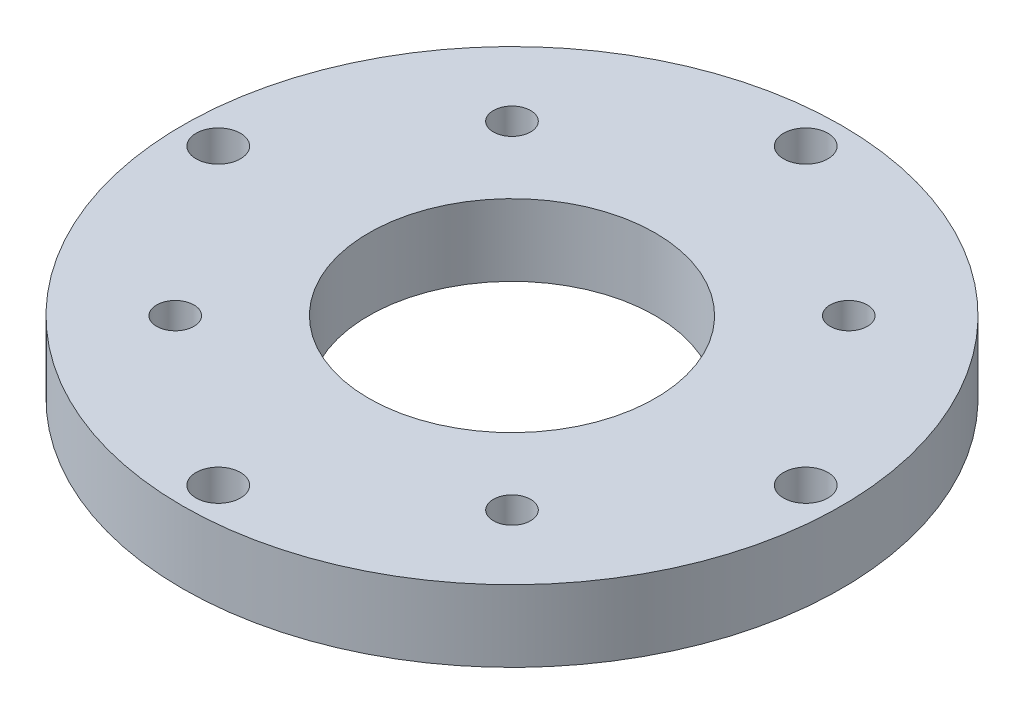
ISO-10303-21;
HEADER;
FILE_DESCRIPTION(('STEP AP214'),'2;1');
FILE_NAME('part.step','',(''),(''),'','','');
FILE_SCHEMA(('AUTOMOTIVE_DESIGN { 1 0 10303 214 1 1 1 1 }'));
ENDSEC;
DATA;
#1=APPLICATION_CONTEXT('core data for automotive mechanical design processes');
#2=APPLICATION_PROTOCOL_DEFINITION('international standard','automotive_design',2000,#1);
#3=PRODUCT_CONTEXT('',#1,'mechanical');
#4=PRODUCT('Part','Part','',(#3));
#5=PRODUCT_RELATED_PRODUCT_CATEGORY('part','',(#4));
#6=PRODUCT_DEFINITION_FORMATION('','',#4);
#7=PRODUCT_DEFINITION_CONTEXT('part definition',#1,'design');
#8=PRODUCT_DEFINITION('design','',#6,#7);
#9=PRODUCT_DEFINITION_SHAPE('','',#8);
#10=(LENGTH_UNIT() NAMED_UNIT(*) SI_UNIT(.MILLI.,.METRE.));
#11=(NAMED_UNIT(*) PLANE_ANGLE_UNIT() SI_UNIT($,.RADIAN.));
#12=(NAMED_UNIT(*) SI_UNIT($,.STERADIAN.) SOLID_ANGLE_UNIT());
#13=UNCERTAINTY_MEASURE_WITH_UNIT(LENGTH_MEASURE(1.E-05),#10,'distance_accuracy_value','');
#14=(GEOMETRIC_REPRESENTATION_CONTEXT(3) GLOBAL_UNCERTAINTY_ASSIGNED_CONTEXT((#13)) GLOBAL_UNIT_ASSIGNED_CONTEXT((#10,
#11,#12)) REPRESENTATION_CONTEXT('',''));
#15=CARTESIAN_POINT('',(0.,0.,0.));
#16=DIRECTION('',(0.,0.,1.));
#17=DIRECTION('',(1.,0.,0.));
#18=AXIS2_PLACEMENT_3D('',#15,#16,#17);
#19=CARTESIAN_POINT('',(-24.2933956091395,4.,14.0257984944668));
#20=DIRECTION('',(-0.866025403784439,0.,0.5));
#21=DIRECTION('',(0.5,0.,0.866025403784439));
#22=AXIS2_PLACEMENT_3D('',#19,#20,#21);
#23=PLANE('',#22);
#24=DIRECTION('',(-0.5,0.,-0.866025403784439));
#25=VECTOR('',#24,1.);
#26=CARTESIAN_POINT('',(-24.2933956091395,0.,14.0257984944668));
#27=LINE('',#26,#25);
#28=CARTESIAN_POINT('',(-18.8234628195631,0.,23.5));
#29=VERTEX_POINT('',#28);
#30=CARTESIAN_POINT('',(-21.1617314097811,0.,19.45));
#31=VERTEX_POINT('',#30);
#32=EDGE_CURVE('E362',#29,#31,#27,.T.);
#33=ORIENTED_EDGE('',*,*,#32,.F.);
#34=DIRECTION('',(0.,-1.,0.));
#35=VECTOR('',#34,1.);
#36=CARTESIAN_POINT('',(-18.8234628195631,4.,23.5));
#37=LINE('',#36,#35);
#38=CARTESIAN_POINT('',(-18.8234628195631,4.,23.5));
#39=VERTEX_POINT('',#38);
#40=EDGE_CURVE('E12',#39,#29,#37,.T.);
#41=ORIENTED_EDGE('',*,*,#40,.F.);
#42=DIRECTION('',(-0.5,0.,-0.866025403784439));
#43=VECTOR('',#42,1.);
#44=CARTESIAN_POINT('',(-24.2933956091395,4.,14.0257984944668));
#45=LINE('',#44,#43);
#46=CARTESIAN_POINT('',(-21.1617314097811,4.,19.45));
#47=VERTEX_POINT('',#46);
#48=EDGE_CURVE('E266',#39,#47,#45,.T.);
#49=ORIENTED_EDGE('',*,*,#48,.T.);
#50=DIRECTION('',(0.,-1.,0.));
#51=VECTOR('',#50,1.);
#52=CARTESIAN_POINT('',(-21.1617314097811,4.,19.45));
#53=LINE('',#52,#51);
#54=EDGE_CURVE('E197',#47,#31,#53,.T.);
#55=ORIENTED_EDGE('',*,*,#54,.T.);
#56=EDGE_LOOP('',(#33,#41,#49,#55));
#57=FACE_BOUND('',#56,.T.);
#58=ADVANCED_FACE('F93',(#57),#23,.T.);
#59=CARTESIAN_POINT('',(-3.94179862020517,4.,-2.27579849446675));
#60=DIRECTION('',(-0.866025403784439,0.,-0.5));
#61=DIRECTION('',(-0.5,0.,0.866025403784439));
#62=AXIS2_PLACEMENT_3D('',#59,#60,#61);
#63=PLANE('',#62);
#64=DIRECTION('',(0.5,0.,-0.866025403784439));
#65=VECTOR('',#64,1.);
#66=CARTESIAN_POINT('',(-3.94179862020517,0.,-2.27579849446675));
#67=LINE('',#66,#65);
#68=CARTESIAN_POINT('',(-21.1617314097811,0.,27.55));
#69=VERTEX_POINT('',#68);
#70=EDGE_CURVE('E364',#69,#29,#67,.T.);
#71=ORIENTED_EDGE('',*,*,#70,.F.);
#72=DIRECTION('',(0.,-1.,0.));
#73=VECTOR('',#72,1.);
#74=CARTESIAN_POINT('',(-21.1617314097811,4.,27.55));
#75=LINE('',#74,#73);
#76=CARTESIAN_POINT('',(-21.1617314097811,4.,27.55));
#77=VERTEX_POINT('',#76);
#78=EDGE_CURVE('E103',#77,#69,#75,.T.);
#79=ORIENTED_EDGE('',*,*,#78,.F.);
#80=DIRECTION('',(0.5,0.,-0.866025403784439));
#81=VECTOR('',#80,1.);
#82=CARTESIAN_POINT('',(-3.94179862020517,4.,-2.27579849446675));
#83=LINE('',#82,#81);
#84=EDGE_CURVE('E276',#77,#39,#83,.T.);
#85=ORIENTED_EDGE('',*,*,#84,.T.);
#86=ORIENTED_EDGE('',*,*,#40,.T.);
#87=EDGE_LOOP('',(#71,#79,#85,#86));
#88=FACE_BOUND('',#87,.T.);
#89=ADVANCED_FACE('F521',(#88),#63,.T.);
#90=CARTESIAN_POINT('',(0.,4.,27.55));
#91=DIRECTION('',(0.,0.,-1.));
#92=DIRECTION('',(-1.,0.,0.));
#93=AXIS2_PLACEMENT_3D('',#90,#91,#92);
#94=PLANE('',#93);
#95=DIRECTION('',(1.,0.,0.));
#96=VECTOR('',#95,1.);
#97=CARTESIAN_POINT('',(0.,0.,27.55));
#98=LINE('',#97,#96);
#99=CARTESIAN_POINT('',(-25.8382685902171,0.,27.55));
#100=VERTEX_POINT('',#99);
#101=EDGE_CURVE('E367',#100,#69,#98,.T.);
#102=ORIENTED_EDGE('',*,*,#101,.F.);
#103=DIRECTION('',(0.,-1.,0.));
#104=VECTOR('',#103,1.);
#105=CARTESIAN_POINT('',(-25.8382685902171,4.,27.55));
#106=LINE('',#105,#104);
#107=CARTESIAN_POINT('',(-25.8382685902171,4.,27.55));
#108=VERTEX_POINT('',#107);
#109=EDGE_CURVE('E384',#108,#100,#106,.T.);
#110=ORIENTED_EDGE('',*,*,#109,.F.);
#111=DIRECTION('',(1.,0.,0.));
#112=VECTOR('',#111,1.);
#113=CARTESIAN_POINT('',(0.,4.,27.55));
#114=LINE('',#113,#112);
#115=EDGE_CURVE('E279',#108,#77,#114,.T.);
#116=ORIENTED_EDGE('',*,*,#115,.T.);
#117=ORIENTED_EDGE('',*,*,#78,.T.);
#118=EDGE_LOOP('',(#102,#110,#116,#117));
#119=FACE_BOUND('',#118,.T.);
#120=ADVANCED_FACE('F526',(#119),#94,.T.);
#121=CARTESIAN_POINT('',(-31.3082013797935,4.,18.0757984944668));
#122=DIRECTION('',(0.866025403784439,0.,-0.5));
#123=DIRECTION('',(-0.5,0.,-0.866025403784439));
#124=AXIS2_PLACEMENT_3D('',#121,#122,#123);
#125=PLANE('',#124);
#126=DIRECTION('',(0.5,0.,0.866025403784439));
#127=VECTOR('',#126,1.);
#128=CARTESIAN_POINT('',(-31.3082013797935,0.,18.0757984944668));
#129=LINE('',#128,#127);
#130=CARTESIAN_POINT('',(-28.1765371804351,0.,23.5));
#131=VERTEX_POINT('',#130);
#132=EDGE_CURVE('E370',#131,#100,#129,.T.);
#133=ORIENTED_EDGE('',*,*,#132,.F.);
#134=DIRECTION('',(0.,-1.,0.));
#135=VECTOR('',#134,1.);
#136=CARTESIAN_POINT('',(-28.1765371804351,4.,23.5));
#137=LINE('',#136,#135);
#138=CARTESIAN_POINT('',(-28.1765371804351,4.,23.5));
#139=VERTEX_POINT('',#138);
#140=EDGE_CURVE('E382',#139,#131,#137,.T.);
#141=ORIENTED_EDGE('',*,*,#140,.F.);
#142=DIRECTION('',(0.5,0.,0.866025403784439));
#143=VECTOR('',#142,1.);
#144=CARTESIAN_POINT('',(-31.3082013797935,4.,18.0757984944668));
#145=LINE('',#144,#143);
#146=EDGE_CURVE('E288',#139,#108,#145,.T.);
#147=ORIENTED_EDGE('',*,*,#146,.T.);
#148=ORIENTED_EDGE('',*,*,#109,.T.);
#149=EDGE_LOOP('',(#133,#141,#147,#148));
#150=FACE_BOUND('',#149,.T.);
#151=ADVANCED_FACE('F671',(#150),#125,.T.);
#152=CARTESIAN_POINT('',(-10.9566043908591,4.,-6.32579849446675));
#153=DIRECTION('',(0.866025403784439,0.,0.5));
#154=DIRECTION('',(0.5,0.,-0.866025403784439));
#155=AXIS2_PLACEMENT_3D('',#152,#153,#154);
#156=PLANE('',#155);
#157=DIRECTION('',(-0.5,0.,0.866025403784439));
#158=VECTOR('',#157,1.);
#159=CARTESIAN_POINT('',(-10.9566043908591,0.,-6.32579849446675));
#160=LINE('',#159,#158);
#161=CARTESIAN_POINT('',(-25.8382685902171,0.,19.45));
#162=VERTEX_POINT('',#161);
#163=EDGE_CURVE('E373',#162,#131,#160,.T.);
#164=ORIENTED_EDGE('',*,*,#163,.F.);
#165=DIRECTION('',(0.,-1.,0.));
#166=VECTOR('',#165,1.);
#167=CARTESIAN_POINT('',(-25.8382685902171,4.,19.45));
#168=LINE('',#167,#166);
#169=CARTESIAN_POINT('',(-25.8382685902171,4.,19.45));
#170=VERTEX_POINT('',#169);
#171=EDGE_CURVE('E189',#170,#162,#168,.T.);
#172=ORIENTED_EDGE('',*,*,#171,.F.);
#173=DIRECTION('',(-0.5,0.,0.866025403784439));
#174=VECTOR('',#173,1.);
#175=CARTESIAN_POINT('',(-10.9566043908591,4.,-6.32579849446675));
#176=LINE('',#175,#174);
#177=EDGE_CURVE('E112',#170,#139,#176,.T.);
#178=ORIENTED_EDGE('',*,*,#177,.T.);
#179=ORIENTED_EDGE('',*,*,#140,.T.);
#180=EDGE_LOOP('',(#164,#172,#178,#179));
#181=FACE_BOUND('',#180,.T.);
#182=ADVANCED_FACE('F668',(#181),#156,.T.);
#183=CARTESIAN_POINT('',(14.0257984944671,4.,24.29339560914));
#184=DIRECTION('',(0.5,0.,0.866025403784439));
#185=DIRECTION('',(0.866025403784439,0.,-0.5));
#186=AXIS2_PLACEMENT_3D('',#183,#184,#185);
#187=PLANE('',#186);
#188=DIRECTION('',(-0.866025403784439,0.,0.5));
#189=VECTOR('',#188,1.);
#190=CARTESIAN_POINT('',(14.0257984944671,0.,24.29339560914));
#191=LINE('',#190,#189);
#192=CARTESIAN_POINT('',(23.5000000000012,0.,18.8234628195632));
#193=VERTEX_POINT('',#192);
#194=CARTESIAN_POINT('',(19.4500000000012,0.,21.1617314097811));
#195=VERTEX_POINT('',#194);
#196=EDGE_CURVE('E344',#193,#195,#191,.T.);
#197=ORIENTED_EDGE('',*,*,#196,.F.);
#198=DIRECTION('',(0.,-1.,0.));
#199=VECTOR('',#198,1.);
#200=CARTESIAN_POINT('',(23.5000000000012,4.,18.8234628195632));
#201=LINE('',#200,#199);
#202=CARTESIAN_POINT('',(23.5000000000012,4.,18.8234628195632));
#203=VERTEX_POINT('',#202);
#204=EDGE_CURVE('E273',#203,#193,#201,.T.);
#205=ORIENTED_EDGE('',*,*,#204,.F.);
#206=DIRECTION('',(-0.866025403784439,0.,0.5));
#207=VECTOR('',#206,1.);
#208=CARTESIAN_POINT('',(14.0257984944671,4.,24.29339560914));
#209=LINE('',#208,#207);
#210=CARTESIAN_POINT('',(19.4500000000012,4.,21.1617314097811));
#211=VERTEX_POINT('',#210);
#212=EDGE_CURVE('E471',#203,#211,#209,.T.);
#213=ORIENTED_EDGE('',*,*,#212,.T.);
#214=DIRECTION('',(0.,-1.,0.));
#215=VECTOR('',#214,1.);
#216=CARTESIAN_POINT('',(19.4500000000012,4.,21.1617314097811));
#217=LINE('',#216,#215);
#218=EDGE_CURVE('E387',#211,#195,#217,.T.);
#219=ORIENTED_EDGE('',*,*,#218,.T.);
#220=EDGE_LOOP('',(#197,#205,#213,#219));
#221=FACE_BOUND('',#220,.T.);
#222=ADVANCED_FACE('F505',(#221),#187,.T.);
#223=CARTESIAN_POINT('',(-2.27579849446648,4.,3.9417986202047));
#224=DIRECTION('',(-0.5,0.,0.866025403784439));
#225=DIRECTION('',(0.866025403784439,0.,0.5));
#226=AXIS2_PLACEMENT_3D('',#223,#224,#225);
#227=PLANE('',#226);
#228=DIRECTION('',(-0.866025403784439,0.,-0.5));
#229=VECTOR('',#228,1.);
#230=CARTESIAN_POINT('',(-2.27579849446648,0.,3.9417986202047));
#231=LINE('',#230,#229);
#232=CARTESIAN_POINT('',(27.5500000000012,0.,21.1617314097811));
#233=VERTEX_POINT('',#232);
#234=EDGE_CURVE('E347',#233,#193,#231,.T.);
#235=ORIENTED_EDGE('',*,*,#234,.F.);
#236=DIRECTION('',(0.,-1.,0.));
#237=VECTOR('',#236,1.);
#238=CARTESIAN_POINT('',(27.5500000000012,4.,21.1617314097811));
#239=LINE('',#238,#237);
#240=CARTESIAN_POINT('',(27.5500000000012,4.,21.1617314097811));
#241=VERTEX_POINT('',#240);
#242=EDGE_CURVE('E396',#241,#233,#239,.T.);
#243=ORIENTED_EDGE('',*,*,#242,.F.);
#244=DIRECTION('',(-0.866025403784439,0.,-0.5));
#245=VECTOR('',#244,1.);
#246=CARTESIAN_POINT('',(-2.27579849446648,4.,3.9417986202047));
#247=LINE('',#246,#245);
#248=EDGE_CURVE('E474',#241,#203,#247,.T.);
#249=ORIENTED_EDGE('',*,*,#248,.T.);
#250=ORIENTED_EDGE('',*,*,#204,.T.);
#251=EDGE_LOOP('',(#235,#243,#249,#250));
#252=FACE_BOUND('',#251,.T.);
#253=ADVANCED_FACE('F509',(#252),#227,.T.);
#254=CARTESIAN_POINT('',(27.5500000000012,4.,0.));
#255=DIRECTION('',(-1.,0.,0.));
#256=DIRECTION('',(0.,0.,1.));
#257=AXIS2_PLACEMENT_3D('',#254,#255,#256);
#258=PLANE('',#257);
#259=DIRECTION('',(0.,0.,-1.));
#260=VECTOR('',#259,1.);
#261=CARTESIAN_POINT('',(27.5500000000012,0.,0.));
#262=LINE('',#261,#260);
#263=CARTESIAN_POINT('',(27.5500000000012,0.,25.8382685902171));
#264=VERTEX_POINT('',#263);
#265=EDGE_CURVE('E350',#264,#233,#262,.T.);
#266=ORIENTED_EDGE('',*,*,#265,.F.);
#267=DIRECTION('',(0.,-1.,0.));
#268=VECTOR('',#267,1.);
#269=CARTESIAN_POINT('',(27.5500000000012,4.,25.8382685902171));
#270=LINE('',#269,#268);
#271=CARTESIAN_POINT('',(27.5500000000012,4.,25.8382685902171));
#272=VERTEX_POINT('',#271);
#273=EDGE_CURVE('E394',#272,#264,#270,.T.);
#274=ORIENTED_EDGE('',*,*,#273,.F.);
#275=DIRECTION('',(0.,0.,-1.));
#276=VECTOR('',#275,1.);
#277=CARTESIAN_POINT('',(27.5500000000012,4.,0.));
#278=LINE('',#277,#276);
#279=EDGE_CURVE('E477',#272,#241,#278,.T.);
#280=ORIENTED_EDGE('',*,*,#279,.T.);
#281=ORIENTED_EDGE('',*,*,#242,.T.);
#282=EDGE_LOOP('',(#266,#274,#280,#281));
#283=FACE_BOUND('',#282,.T.);
#284=ADVANCED_FACE('F511',(#283),#258,.T.);
#285=CARTESIAN_POINT('',(18.0757984944671,4.,31.308201379794));
#286=DIRECTION('',(-0.5,0.,-0.866025403784439));
#287=DIRECTION('',(-0.866025403784439,0.,0.5));
#288=AXIS2_PLACEMENT_3D('',#285,#286,#287);
#289=PLANE('',#288);
#290=DIRECTION('',(0.866025403784439,0.,-0.5));
#291=VECTOR('',#290,1.);
#292=CARTESIAN_POINT('',(18.0757984944671,0.,31.308201379794));
#293=LINE('',#292,#291);
#294=CARTESIAN_POINT('',(23.5000000000012,0.,28.1765371804351));
#295=VERTEX_POINT('',#294);
#296=EDGE_CURVE('E353',#295,#264,#293,.T.);
#297=ORIENTED_EDGE('',*,*,#296,.F.);
#298=DIRECTION('',(0.,-1.,0.));
#299=VECTOR('',#298,1.);
#300=CARTESIAN_POINT('',(23.5000000000012,4.,28.1765371804351));
#301=LINE('',#300,#299);
#302=CARTESIAN_POINT('',(23.5000000000012,4.,28.1765371804351));
#303=VERTEX_POINT('',#302);
#304=EDGE_CURVE('E392',#303,#295,#301,.T.);
#305=ORIENTED_EDGE('',*,*,#304,.F.);
#306=DIRECTION('',(0.866025403784439,0.,-0.5));
#307=VECTOR('',#306,1.);
#308=CARTESIAN_POINT('',(18.0757984944671,4.,31.308201379794));
#309=LINE('',#308,#307);
#310=EDGE_CURVE('E480',#303,#272,#309,.T.);
#311=ORIENTED_EDGE('',*,*,#310,.T.);
#312=ORIENTED_EDGE('',*,*,#273,.T.);
#313=EDGE_LOOP('',(#297,#305,#311,#312));
#314=FACE_BOUND('',#313,.T.);
#315=ADVANCED_FACE('F495',(#314),#289,.T.);
#316=CARTESIAN_POINT('',(-6.32579849446648,4.,10.9566043908587));
#317=DIRECTION('',(0.5,0.,-0.866025403784439));
#318=DIRECTION('',(-0.866025403784439,0.,-0.5));
#319=AXIS2_PLACEMENT_3D('',#316,#317,#318);
#320=PLANE('',#319);
#321=DIRECTION('',(0.866025403784439,0.,0.5));
#322=VECTOR('',#321,1.);
#323=CARTESIAN_POINT('',(-6.32579849446648,0.,10.9566043908587));
#324=LINE('',#323,#322);
#325=CARTESIAN_POINT('',(19.4500000000012,0.,25.8382685902171));
#326=VERTEX_POINT('',#325);
#327=EDGE_CURVE('E356',#326,#295,#324,.T.);
#328=ORIENTED_EDGE('',*,*,#327,.F.);
#329=DIRECTION('',(0.,-1.,0.));
#330=VECTOR('',#329,1.);
#331=CARTESIAN_POINT('',(19.4500000000012,4.,25.8382685902171));
#332=LINE('',#331,#330);
#333=CARTESIAN_POINT('',(19.4500000000012,4.,25.8382685902171));
#334=VERTEX_POINT('',#333);
#335=EDGE_CURVE('E389',#334,#326,#332,.T.);
#336=ORIENTED_EDGE('',*,*,#335,.F.);
#337=DIRECTION('',(0.866025403784439,0.,0.5));
#338=VECTOR('',#337,1.);
#339=CARTESIAN_POINT('',(-6.32579849446648,4.,10.9566043908587));
#340=LINE('',#339,#338);
#341=EDGE_CURVE('E282',#334,#303,#340,.T.);
#342=ORIENTED_EDGE('',*,*,#341,.T.);
#343=ORIENTED_EDGE('',*,*,#304,.T.);
#344=EDGE_LOOP('',(#328,#336,#342,#343));
#345=FACE_BOUND('',#344,.T.);
#346=ADVANCED_FACE('F486',(#345),#320,.T.);
#347=CARTESIAN_POINT('',(24.2933956091409,4.,-14.0257984944676));
#348=DIRECTION('',(0.866025403784439,0.,-0.5));
#349=DIRECTION('',(-0.5,0.,-0.866025403784439));
#350=AXIS2_PLACEMENT_3D('',#347,#348,#349);
#351=PLANE('',#350);
#352=DIRECTION('',(0.5,0.,0.866025403784439));
#353=VECTOR('',#352,1.);
#354=CARTESIAN_POINT('',(24.2933956091409,0.,-14.0257984944676));
#355=LINE('',#354,#353);
#356=CARTESIAN_POINT('',(18.8234628195643,0.,-23.5000000000011));
#357=VERTEX_POINT('',#356);
#358=CARTESIAN_POINT('',(21.1617314097823,0.,-19.4500000000012));
#359=VERTEX_POINT('',#358);
#360=EDGE_CURVE('E326',#357,#359,#355,.T.);
#361=ORIENTED_EDGE('',*,*,#360,.F.);
#362=DIRECTION('',(0.,-1.,0.));
#363=VECTOR('',#362,1.);
#364=CARTESIAN_POINT('',(18.8234628195643,4.,-23.5000000000011));
#365=LINE('',#364,#363);
#366=CARTESIAN_POINT('',(18.8234628195643,4.,-23.5000000000011));
#367=VERTEX_POINT('',#366);
#368=EDGE_CURVE('E390',#367,#357,#365,.T.);
#369=ORIENTED_EDGE('',*,*,#368,.F.);
#370=DIRECTION('',(0.5,0.,0.866025403784439));
#371=VECTOR('',#370,1.);
#372=CARTESIAN_POINT('',(24.2933956091409,4.,-14.0257984944676));
#373=LINE('',#372,#371);
#374=CARTESIAN_POINT('',(21.1617314097823,4.,-19.4500000000012));
#375=VERTEX_POINT('',#374);
#376=EDGE_CURVE('E453',#367,#375,#373,.T.);
#377=ORIENTED_EDGE('',*,*,#376,.T.);
#378=DIRECTION('',(0.,-1.,0.));
#379=VECTOR('',#378,1.);
#380=CARTESIAN_POINT('',(21.1617314097823,4.,-19.4500000000012));
#381=LINE('',#380,#379);
#382=EDGE_CURVE('E399',#375,#359,#381,.T.);
#383=ORIENTED_EDGE('',*,*,#382,.T.);
#384=EDGE_LOOP('',(#361,#369,#377,#383));
#385=FACE_BOUND('',#384,.T.);
#386=ADVANCED_FACE('F535',(#385),#351,.T.);
#387=CARTESIAN_POINT('',(3.94179862020558,4.,2.27579849446699));
#388=DIRECTION('',(0.866025403784439,0.,0.5));
#389=DIRECTION('',(0.5,0.,-0.866025403784439));
#390=AXIS2_PLACEMENT_3D('',#387,#388,#389);
#391=PLANE('',#390);
#392=DIRECTION('',(-0.5,0.,0.866025403784439));
#393=VECTOR('',#392,1.);
#394=CARTESIAN_POINT('',(3.94179862020558,0.,2.27579849446699));
#395=LINE('',#394,#393);
#396=CARTESIAN_POINT('',(21.1617314097823,0.,-27.5500000000011));
#397=VERTEX_POINT('',#396);
#398=EDGE_CURVE('E329',#397,#357,#395,.T.);
#399=ORIENTED_EDGE('',*,*,#398,.F.);
#400=DIRECTION('',(0.,-1.,0.));
#401=VECTOR('',#400,1.);
#402=CARTESIAN_POINT('',(21.1617314097823,4.,-27.5500000000011));
#403=LINE('',#402,#401);
#404=CARTESIAN_POINT('',(21.1617314097823,4.,-27.5500000000011));
#405=VERTEX_POINT('',#404);
#406=EDGE_CURVE('E407',#405,#397,#403,.T.);
#407=ORIENTED_EDGE('',*,*,#406,.F.);
#408=DIRECTION('',(-0.5,0.,0.866025403784439));
#409=VECTOR('',#408,1.);
#410=CARTESIAN_POINT('',(3.94179862020558,4.,2.27579849446699));
#411=LINE('',#410,#409);
#412=EDGE_CURVE('E456',#405,#367,#411,.T.);
#413=ORIENTED_EDGE('',*,*,#412,.T.);
#414=ORIENTED_EDGE('',*,*,#368,.T.);
#415=EDGE_LOOP('',(#399,#407,#413,#414));
#416=FACE_BOUND('',#415,.T.);
#417=ADVANCED_FACE('F539',(#416),#391,.T.);
#418=CARTESIAN_POINT('',(0.,4.,-27.5500000000011));
#419=DIRECTION('',(0.,0.,1.));
#420=DIRECTION('',(1.,0.,0.));
#421=AXIS2_PLACEMENT_3D('',#418,#419,#420);
#422=PLANE('',#421);
#423=DIRECTION('',(-1.,0.,0.));
#424=VECTOR('',#423,1.);
#425=CARTESIAN_POINT('',(0.,0.,-27.5500000000011));
#426=LINE('',#425,#424);
#427=CARTESIAN_POINT('',(25.8382685902183,0.,-27.5500000000011));
#428=VERTEX_POINT('',#427);
#429=EDGE_CURVE('E332',#428,#397,#426,.T.);
#430=ORIENTED_EDGE('',*,*,#429,.F.);
#431=DIRECTION('',(0.,-1.,0.));
#432=VECTOR('',#431,1.);
#433=CARTESIAN_POINT('',(25.8382685902183,4.,-27.5500000000011));
#434=LINE('',#433,#432);
#435=CARTESIAN_POINT('',(25.8382685902183,4.,-27.5500000000011));
#436=VERTEX_POINT('',#435);
#437=EDGE_CURVE('E405',#436,#428,#434,.T.);
#438=ORIENTED_EDGE('',*,*,#437,.F.);
#439=DIRECTION('',(-1.,0.,0.));
#440=VECTOR('',#439,1.);
#441=CARTESIAN_POINT('',(0.,4.,-27.5500000000011));
#442=LINE('',#441,#440);
#443=EDGE_CURVE('E459',#436,#405,#442,.T.);
#444=ORIENTED_EDGE('',*,*,#443,.T.);
#445=ORIENTED_EDGE('',*,*,#406,.T.);
#446=EDGE_LOOP('',(#430,#438,#444,#445));
#447=FACE_BOUND('',#446,.T.);
#448=ADVANCED_FACE('F545',(#447),#422,.T.);
#449=CARTESIAN_POINT('',(31.3082013797948,4.,-18.0757984944676));
#450=DIRECTION('',(-0.866025403784439,0.,0.5));
#451=DIRECTION('',(0.5,0.,0.866025403784439));
#452=AXIS2_PLACEMENT_3D('',#449,#450,#451);
#453=PLANE('',#452);
#454=DIRECTION('',(-0.5,0.,-0.866025403784439));
#455=VECTOR('',#454,1.);
#456=CARTESIAN_POINT('',(31.3082013797948,0.,-18.0757984944676));
#457=LINE('',#456,#455);
#458=CARTESIAN_POINT('',(28.1765371804362,0.,-23.5000000000012));
#459=VERTEX_POINT('',#458);
#460=EDGE_CURVE('E335',#459,#428,#457,.T.);
#461=ORIENTED_EDGE('',*,*,#460,.F.);
#462=DIRECTION('',(0.,-1.,0.));
#463=VECTOR('',#462,1.);
#464=CARTESIAN_POINT('',(28.1765371804362,4.,-23.5000000000012));
#465=LINE('',#464,#463);
#466=CARTESIAN_POINT('',(28.1765371804362,4.,-23.5000000000012));
#467=VERTEX_POINT('',#466);
#468=EDGE_CURVE('E403',#467,#459,#465,.T.);
#469=ORIENTED_EDGE('',*,*,#468,.F.);
#470=DIRECTION('',(-0.5,0.,-0.866025403784439));
#471=VECTOR('',#470,1.);
#472=CARTESIAN_POINT('',(31.3082013797948,4.,-18.0757984944676));
#473=LINE('',#472,#471);
#474=EDGE_CURVE('E462',#467,#436,#473,.T.);
#475=ORIENTED_EDGE('',*,*,#474,.T.);
#476=ORIENTED_EDGE('',*,*,#437,.T.);
#477=EDGE_LOOP('',(#461,#469,#475,#476));
#478=FACE_BOUND('',#477,.T.);
#479=ADVANCED_FACE('F724',(#478),#453,.T.);
#480=CARTESIAN_POINT('',(10.9566043908595,4.,6.32579849446699));
#481=DIRECTION('',(-0.866025403784439,0.,-0.5));
#482=DIRECTION('',(-0.5,0.,0.866025403784439));
#483=AXIS2_PLACEMENT_3D('',#480,#481,#482);
#484=PLANE('',#483);
#485=DIRECTION('',(0.5,0.,-0.866025403784439));
#486=VECTOR('',#485,1.);
#487=CARTESIAN_POINT('',(10.9566043908595,0.,6.32579849446699));
#488=LINE('',#487,#486);
#489=CARTESIAN_POINT('',(25.8382685902183,0.,-19.4500000000012));
#490=VERTEX_POINT('',#489);
#491=EDGE_CURVE('E338',#490,#459,#488,.T.);
#492=ORIENTED_EDGE('',*,*,#491,.F.);
#493=DIRECTION('',(0.,-1.,0.));
#494=VECTOR('',#493,1.);
#495=CARTESIAN_POINT('',(25.8382685902183,4.,-19.4500000000012));
#496=LINE('',#495,#494);
#497=CARTESIAN_POINT('',(25.8382685902183,4.,-19.4500000000012));
#498=VERTEX_POINT('',#497);
#499=EDGE_CURVE('E401',#498,#490,#496,.T.);
#500=ORIENTED_EDGE('',*,*,#499,.F.);
#501=DIRECTION('',(0.5,0.,-0.866025403784439));
#502=VECTOR('',#501,1.);
#503=CARTESIAN_POINT('',(10.9566043908595,4.,6.32579849446699));
#504=LINE('',#503,#502);
#505=EDGE_CURVE('E465',#498,#467,#504,.T.);
#506=ORIENTED_EDGE('',*,*,#505,.T.);
#507=ORIENTED_EDGE('',*,*,#468,.T.);
#508=EDGE_LOOP('',(#492,#500,#506,#507));
#509=FACE_BOUND('',#508,.T.);
#510=ADVANCED_FACE('F568',(#509),#484,.T.);
#511=CARTESIAN_POINT('',(-14.0257984944673,4.,-24.2933956091404));
#512=DIRECTION('',(-0.5,0.,-0.866025403784439));
#513=DIRECTION('',(-0.866025403784439,0.,0.5));
#514=AXIS2_PLACEMENT_3D('',#511,#512,#513);
#515=PLANE('',#514);
#516=DIRECTION('',(0.866025403784439,0.,-0.5));
#517=VECTOR('',#516,1.);
#518=CARTESIAN_POINT('',(-14.0257984944673,0.,-24.2933956091404));
#519=LINE('',#518,#517);
#520=CARTESIAN_POINT('',(-23.5,0.,-18.8234628195643));
#521=VERTEX_POINT('',#520);
#522=CARTESIAN_POINT('',(-19.45,0.,-21.1617314097822));
#523=VERTEX_POINT('',#522);
#524=EDGE_CURVE('E308',#521,#523,#519,.T.);
#525=ORIENTED_EDGE('',*,*,#524,.F.);
#526=DIRECTION('',(0.,-1.,0.));
#527=VECTOR('',#526,1.);
#528=CARTESIAN_POINT('',(-23.5,4.,-18.8234628195643));
#529=LINE('',#528,#527);
#530=CARTESIAN_POINT('',(-23.5,4.,-18.8234628195643));
#531=VERTEX_POINT('',#530);
#532=EDGE_CURVE('E97',#531,#521,#529,.T.);
#533=ORIENTED_EDGE('',*,*,#532,.F.);
#534=DIRECTION('',(0.866025403784439,0.,-0.5));
#535=VECTOR('',#534,1.);
#536=CARTESIAN_POINT('',(-14.0257984944673,4.,-24.2933956091404));
#537=LINE('',#536,#535);
#538=CARTESIAN_POINT('',(-19.45,4.,-21.1617314097822));
#539=VERTEX_POINT('',#538);
#540=EDGE_CURVE('E379',#531,#539,#537,.T.);
#541=ORIENTED_EDGE('',*,*,#540,.T.);
#542=DIRECTION('',(0.,-1.,0.));
#543=VECTOR('',#542,1.);
#544=CARTESIAN_POINT('',(-19.45,4.,-21.1617314097822));
#545=LINE('',#544,#543);
#546=EDGE_CURVE('E268',#539,#523,#545,.T.);
#547=ORIENTED_EDGE('',*,*,#546,.T.);
#548=EDGE_LOOP('',(#525,#533,#541,#547));
#549=FACE_BOUND('',#548,.T.);
#550=ADVANCED_FACE('F430',(#549),#515,.T.);
#551=CARTESIAN_POINT('',(2.27579849446725,4.,-3.94179862020603));
#552=DIRECTION('',(0.5,0.,-0.866025403784438));
#553=DIRECTION('',(-0.866025403784438,0.,-0.5));
#554=AXIS2_PLACEMENT_3D('',#551,#552,#553);
#555=PLANE('',#554);
#556=DIRECTION('',(0.866025403784438,0.,0.5));
#557=VECTOR('',#556,1.);
#558=CARTESIAN_POINT('',(2.27579849446725,0.,-3.94179862020603));
#559=LINE('',#558,#557);
#560=CARTESIAN_POINT('',(-27.55,0.,-21.1617314097823));
#561=VERTEX_POINT('',#560);
#562=EDGE_CURVE('E311',#561,#521,#559,.T.);
#563=ORIENTED_EDGE('',*,*,#562,.F.);
#564=DIRECTION('',(0.,-1.,0.));
#565=VECTOR('',#564,1.);
#566=CARTESIAN_POINT('',(-27.55,4.,-21.1617314097823));
#567=LINE('',#566,#565);
#568=CARTESIAN_POINT('',(-27.55,4.,-21.1617314097823));
#569=VERTEX_POINT('',#568);
#570=EDGE_CURVE('E416',#569,#561,#567,.T.);
#571=ORIENTED_EDGE('',*,*,#570,.F.);
#572=DIRECTION('',(0.866025403784438,0.,0.5));
#573=VECTOR('',#572,1.);
#574=CARTESIAN_POINT('',(2.27579849446725,4.,-3.94179862020603));
#575=LINE('',#574,#573);
#576=EDGE_CURVE('E427',#569,#531,#575,.T.);
#577=ORIENTED_EDGE('',*,*,#576,.T.);
#578=ORIENTED_EDGE('',*,*,#532,.T.);
#579=EDGE_LOOP('',(#563,#571,#577,#578));
#580=FACE_BOUND('',#579,.T.);
#581=ADVANCED_FACE('F426',(#580),#555,.T.);
#582=CARTESIAN_POINT('',(-27.55,4.,0.));
#583=DIRECTION('',(1.,0.,0.));
#584=DIRECTION('',(0.,0.,-1.));
#585=AXIS2_PLACEMENT_3D('',#582,#583,#584);
#586=PLANE('',#585);
#587=DIRECTION('',(0.,0.,1.));
#588=VECTOR('',#587,1.);
#589=CARTESIAN_POINT('',(-27.55,0.,0.));
#590=LINE('',#589,#588);
#591=CARTESIAN_POINT('',(-27.55,0.,-25.8382685902182));
#592=VERTEX_POINT('',#591);
#593=EDGE_CURVE('E314',#592,#561,#590,.T.);
#594=ORIENTED_EDGE('',*,*,#593,.F.);
#595=DIRECTION('',(0.,-1.,0.));
#596=VECTOR('',#595,1.);
#597=CARTESIAN_POINT('',(-27.55,4.,-25.8382685902182));
#598=LINE('',#597,#596);
#599=CARTESIAN_POINT('',(-27.55,4.,-25.8382685902182));
#600=VERTEX_POINT('',#599);
#601=EDGE_CURVE('E415',#600,#592,#598,.T.);
#602=ORIENTED_EDGE('',*,*,#601,.F.);
#603=DIRECTION('',(0.,0.,1.));
#604=VECTOR('',#603,1.);
#605=CARTESIAN_POINT('',(-27.55,4.,0.));
#606=LINE('',#605,#604);
#607=EDGE_CURVE('E440',#600,#569,#606,.T.);
#608=ORIENTED_EDGE('',*,*,#607,.T.);
#609=ORIENTED_EDGE('',*,*,#570,.T.);
#610=EDGE_LOOP('',(#594,#602,#608,#609));
#611=FACE_BOUND('',#610,.T.);
#612=ADVANCED_FACE('F438',(#611),#586,.T.);
#613=CARTESIAN_POINT('',(-18.0757984944672,4.,-31.3082013797943));
#614=DIRECTION('',(0.5,0.,0.866025403784439));
#615=DIRECTION('',(0.866025403784439,0.,-0.5));
#616=AXIS2_PLACEMENT_3D('',#613,#614,#615);
#617=PLANE('',#616);
#618=DIRECTION('',(-0.866025403784439,0.,0.5));
#619=VECTOR('',#618,1.);
#620=CARTESIAN_POINT('',(-18.0757984944672,0.,-31.3082013797943));
#621=LINE('',#620,#619);
#622=CARTESIAN_POINT('',(-23.5,0.,-28.1765371804362));
#623=VERTEX_POINT('',#622);
#624=EDGE_CURVE('E317',#623,#592,#621,.T.);
#625=ORIENTED_EDGE('',*,*,#624,.F.);
#626=DIRECTION('',(0.,-1.,0.));
#627=VECTOR('',#626,1.);
#628=CARTESIAN_POINT('',(-23.5,4.,-28.1765371804362));
#629=LINE('',#628,#627);
#630=CARTESIAN_POINT('',(-23.5,4.,-28.1765371804362));
#631=VERTEX_POINT('',#630);
#632=EDGE_CURVE('E413',#631,#623,#629,.T.);
#633=ORIENTED_EDGE('',*,*,#632,.F.);
#634=DIRECTION('',(-0.866025403784439,0.,0.5));
#635=VECTOR('',#634,1.);
#636=CARTESIAN_POINT('',(-18.0757984944672,4.,-31.3082013797943));
#637=LINE('',#636,#635);
#638=EDGE_CURVE('E443',#631,#600,#637,.T.);
#639=ORIENTED_EDGE('',*,*,#638,.T.);
#640=ORIENTED_EDGE('',*,*,#601,.T.);
#641=EDGE_LOOP('',(#625,#633,#639,#640));
#642=FACE_BOUND('',#641,.T.);
#643=ADVANCED_FACE('F444',(#642),#617,.T.);
#644=CARTESIAN_POINT('',(6.32579849446725,4.,-10.95660439086));
#645=DIRECTION('',(-0.500000000000001,0.,0.866025403784438));
#646=DIRECTION('',(0.866025403784438,0.,0.500000000000001));
#647=AXIS2_PLACEMENT_3D('',#644,#645,#646);
#648=PLANE('',#647);
#649=DIRECTION('',(-0.866025403784438,0.,-0.500000000000001));
#650=VECTOR('',#649,1.);
#651=CARTESIAN_POINT('',(6.32579849446725,0.,-10.95660439086));
#652=LINE('',#651,#650);
#653=CARTESIAN_POINT('',(-19.45,0.,-25.8382685902182));
#654=VERTEX_POINT('',#653);
#655=EDGE_CURVE('E320',#654,#623,#652,.T.);
#656=ORIENTED_EDGE('',*,*,#655,.F.);
#657=DIRECTION('',(0.,-1.,0.));
#658=VECTOR('',#657,1.);
#659=CARTESIAN_POINT('',(-19.45,4.,-25.8382685902182));
#660=LINE('',#659,#658);
#661=CARTESIAN_POINT('',(-19.45,4.,-25.8382685902182));
#662=VERTEX_POINT('',#661);
#663=EDGE_CURVE('E411',#662,#654,#660,.T.);
#664=ORIENTED_EDGE('',*,*,#663,.F.);
#665=DIRECTION('',(-0.866025403784438,0.,-0.500000000000001));
#666=VECTOR('',#665,1.);
#667=CARTESIAN_POINT('',(6.32579849446725,4.,-10.95660439086));
#668=LINE('',#667,#666);
#669=EDGE_CURVE('E205',#662,#631,#668,.T.);
#670=ORIENTED_EDGE('',*,*,#669,.T.);
#671=ORIENTED_EDGE('',*,*,#632,.T.);
#672=EDGE_LOOP('',(#656,#664,#670,#671));
#673=FACE_BOUND('',#672,.T.);
#674=ADVANCED_FACE('F556',(#673),#648,.T.);
#675=CARTESIAN_POINT('',(0.,4.,19.45));
#676=DIRECTION('',(0.,0.,1.));
#677=DIRECTION('',(1.,0.,0.));
#678=AXIS2_PLACEMENT_3D('',#675,#676,#677);
#679=PLANE('',#678);
#680=DIRECTION('',(-1.,0.,0.));
#681=VECTOR('',#680,1.);
#682=CARTESIAN_POINT('',(0.,0.,19.45));
#683=LINE('',#682,#681);
#684=EDGE_CURVE('E272',#31,#162,#683,.T.);
#685=ORIENTED_EDGE('',*,*,#684,.F.);
#686=ORIENTED_EDGE('',*,*,#54,.F.);
#687=DIRECTION('',(-1.,0.,0.));
#688=VECTOR('',#687,1.);
#689=CARTESIAN_POINT('',(0.,4.,19.45));
#690=LINE('',#689,#688);
#691=EDGE_CURVE('E263',#47,#170,#690,.T.);
#692=ORIENTED_EDGE('',*,*,#691,.T.);
#693=ORIENTED_EDGE('',*,*,#171,.T.);
#694=EDGE_LOOP('',(#685,#686,#692,#693));
#695=FACE_BOUND('',#694,.T.);
#696=ADVANCED_FACE('F270',(#695),#679,.T.);
#697=CARTESIAN_POINT('',(19.4500000000012,4.,0.));
#698=DIRECTION('',(1.,0.,0.));
#699=DIRECTION('',(0.,0.,-1.));
#700=AXIS2_PLACEMENT_3D('',#697,#698,#699);
#701=PLANE('',#700);
#702=DIRECTION('',(0.,0.,1.));
#703=VECTOR('',#702,1.);
#704=CARTESIAN_POINT('',(19.4500000000012,0.,0.));
#705=LINE('',#704,#703);
#706=EDGE_CURVE('E359',#195,#326,#705,.T.);
#707=ORIENTED_EDGE('',*,*,#706,.F.);
#708=ORIENTED_EDGE('',*,*,#218,.F.);
#709=DIRECTION('',(0.,0.,1.));
#710=VECTOR('',#709,1.);
#711=CARTESIAN_POINT('',(19.4500000000012,4.,0.));
#712=LINE('',#711,#710);
#713=EDGE_CURVE('E277',#211,#334,#712,.T.);
#714=ORIENTED_EDGE('',*,*,#713,.T.);
#715=ORIENTED_EDGE('',*,*,#335,.T.);
#716=EDGE_LOOP('',(#707,#708,#714,#715));
#717=FACE_BOUND('',#716,.T.);
#718=ADVANCED_FACE('F502',(#717),#701,.T.);
#719=CARTESIAN_POINT('',(0.,4.,-19.4500000000012));
#720=DIRECTION('',(0.,0.,-1.));
#721=DIRECTION('',(-1.,0.,0.));
#722=AXIS2_PLACEMENT_3D('',#719,#720,#721);
#723=PLANE('',#722);
#724=DIRECTION('',(1.,0.,0.));
#725=VECTOR('',#724,1.);
#726=CARTESIAN_POINT('',(0.,0.,-19.4500000000012));
#727=LINE('',#726,#725);
#728=EDGE_CURVE('E341',#359,#490,#727,.T.);
#729=ORIENTED_EDGE('',*,*,#728,.F.);
#730=ORIENTED_EDGE('',*,*,#382,.F.);
#731=DIRECTION('',(1.,0.,0.));
#732=VECTOR('',#731,1.);
#733=CARTESIAN_POINT('',(0.,4.,-19.4500000000012));
#734=LINE('',#733,#732);
#735=EDGE_CURVE('E468',#375,#498,#734,.T.);
#736=ORIENTED_EDGE('',*,*,#735,.T.);
#737=ORIENTED_EDGE('',*,*,#499,.T.);
#738=EDGE_LOOP('',(#729,#730,#736,#737));
#739=FACE_BOUND('',#738,.T.);
#740=ADVANCED_FACE('F533',(#739),#723,.T.);
#741=CARTESIAN_POINT('',(-19.45,4.,0.));
#742=DIRECTION('',(-1.,0.,0.));
#743=DIRECTION('',(0.,0.,1.));
#744=AXIS2_PLACEMENT_3D('',#741,#742,#743);
#745=PLANE('',#744);
#746=DIRECTION('',(0.,0.,-1.));
#747=VECTOR('',#746,1.);
#748=CARTESIAN_POINT('',(-19.45,0.,0.));
#749=LINE('',#748,#747);
#750=EDGE_CURVE('E323',#523,#654,#749,.T.);
#751=ORIENTED_EDGE('',*,*,#750,.F.);
#752=ORIENTED_EDGE('',*,*,#546,.F.);
#753=DIRECTION('',(0.,0.,-1.));
#754=VECTOR('',#753,1.);
#755=CARTESIAN_POINT('',(-19.45,4.,0.));
#756=LINE('',#755,#754);
#757=EDGE_CURVE('E446',#539,#662,#756,.T.);
#758=ORIENTED_EDGE('',*,*,#757,.T.);
#759=ORIENTED_EDGE('',*,*,#663,.T.);
#760=EDGE_LOOP('',(#751,#752,#758,#759));
#761=FACE_BOUND('',#760,.T.);
#762=ADVANCED_FACE('F551',(#761),#745,.T.);
#763=CARTESIAN_POINT('',(0.,4.,0.));
#764=DIRECTION('',(0.,-1.,0.));
#765=DIRECTION('',(0.,0.,-1.));
#766=AXIS2_PLACEMENT_3D('',#763,#764,#765);
#767=CYLINDRICAL_SURFACE('',#766,20.);
#768=CARTESIAN_POINT('',(0.,0.,0.));
#769=DIRECTION('',(0.,1.,0.));
#770=DIRECTION('',(0.,0.,1.));
#771=AXIS2_PLACEMENT_3D('',#768,#769,#770);
#772=CIRCLE('',#771,20.);
#773=CARTESIAN_POINT('',(0.,0.,20.));
#774=VERTEX_POINT('',#773);
#775=EDGE_CURVE('E305',#774,#774,#772,.T.);
#776=ORIENTED_EDGE('',*,*,#775,.F.);
#777=EDGE_LOOP('',(#776));
#778=FACE_BOUND('',#777,.T.);
#779=CARTESIAN_POINT('',(0.,10.,0.));
#780=DIRECTION('',(0.,1.,0.));
#781=DIRECTION('',(0.,0.,1.));
#782=AXIS2_PLACEMENT_3D('',#779,#780,#781);
#783=CIRCLE('',#782,20.);
#784=CARTESIAN_POINT('',(0.,10.,20.));
#785=VERTEX_POINT('',#784);
#786=EDGE_CURVE('E606',#785,#785,#783,.T.);
#787=ORIENTED_EDGE('',*,*,#786,.T.);
#788=EDGE_LOOP('',(#787));
#789=FACE_BOUND('',#788,.T.);
#790=ADVANCED_FACE('F554',(#778,#789),#767,.F.);
#791=CARTESIAN_POINT('',(0.,4.,-41.));
#792=DIRECTION('',(0.,-1.,0.));
#793=DIRECTION('',(0.,0.,-1.));
#794=AXIS2_PLACEMENT_3D('',#791,#792,#793);
#795=CYLINDRICAL_SURFACE('',#794,3.1);
#796=CARTESIAN_POINT('',(0.,0.,-41.));
#797=DIRECTION('',(0.,1.,0.));
#798=DIRECTION('',(0.,0.,1.));
#799=AXIS2_PLACEMENT_3D('',#796,#797,#798);
#800=CIRCLE('',#799,3.1);
#801=CARTESIAN_POINT('',(0.,0.,-37.9));
#802=VERTEX_POINT('',#801);
#803=EDGE_CURVE('E302',#802,#802,#800,.T.);
#804=ORIENTED_EDGE('',*,*,#803,.F.);
#805=EDGE_LOOP('',(#804));
#806=FACE_BOUND('',#805,.T.);
#807=CARTESIAN_POINT('',(0.,10.,-41.));
#808=DIRECTION('',(0.,1.,0.));
#809=DIRECTION('',(0.,0.,1.));
#810=AXIS2_PLACEMENT_3D('',#807,#808,#809);
#811=CIRCLE('',#810,3.1);
#812=CARTESIAN_POINT('',(0.,10.,-37.9));
#813=VERTEX_POINT('',#812);
#814=EDGE_CURVE('E597',#813,#813,#811,.T.);
#815=ORIENTED_EDGE('',*,*,#814,.T.);
#816=EDGE_LOOP('',(#815));
#817=FACE_BOUND('',#816,.T.);
#818=ADVANCED_FACE('F571',(#806,#817),#795,.F.);
#819=CARTESIAN_POINT('',(41.,4.,1.43763058292142E-13));
#820=DIRECTION('',(0.,-1.,0.));
#821=DIRECTION('',(0.,0.,-1.));
#822=AXIS2_PLACEMENT_3D('',#819,#820,#821);
#823=CYLINDRICAL_SURFACE('',#822,3.1);
#824=CARTESIAN_POINT('',(41.,0.,1.43763058292142E-13));
#825=DIRECTION('',(0.,1.,0.));
#826=DIRECTION('',(0.,0.,1.));
#827=AXIS2_PLACEMENT_3D('',#824,#825,#826);
#828=CIRCLE('',#827,3.1);
#829=CARTESIAN_POINT('',(41.,0.,3.10000000000014));
#830=VERTEX_POINT('',#829);
#831=EDGE_CURVE('E299',#830,#830,#828,.T.);
#832=ORIENTED_EDGE('',*,*,#831,.F.);
#833=EDGE_LOOP('',(#832));
#834=FACE_BOUND('',#833,.T.);
#835=CARTESIAN_POINT('',(41.,10.,1.43763058292142E-13));
#836=DIRECTION('',(0.,1.,0.));
#837=DIRECTION('',(0.,0.,1.));
#838=AXIS2_PLACEMENT_3D('',#835,#836,#837);
#839=CIRCLE('',#838,3.1);
#840=CARTESIAN_POINT('',(41.,10.,3.10000000000014));
#841=VERTEX_POINT('',#840);
#842=EDGE_CURVE('E593',#841,#841,#839,.T.);
#843=ORIENTED_EDGE('',*,*,#842,.T.);
#844=EDGE_LOOP('',(#843));
#845=FACE_BOUND('',#844,.T.);
#846=ADVANCED_FACE('F575',(#834,#845),#823,.F.);
#847=CARTESIAN_POINT('',(1.15083925441663E-12,4.,41.));
#848=DIRECTION('',(0.,-1.,0.));
#849=DIRECTION('',(0.,0.,-1.));
#850=AXIS2_PLACEMENT_3D('',#847,#848,#849);
#851=CYLINDRICAL_SURFACE('',#850,3.10000000000137);
#852=CARTESIAN_POINT('',(1.15083925441663E-12,0.,41.));
#853=DIRECTION('',(0.,1.,0.));
#854=DIRECTION('',(0.,0.,1.));
#855=AXIS2_PLACEMENT_3D('',#852,#853,#854);
#856=CIRCLE('',#855,3.10000000000137);
#857=CARTESIAN_POINT('',(1.15083925441663E-12,0.,44.1000000000014));
#858=VERTEX_POINT('',#857);
#859=EDGE_CURVE('E295',#858,#858,#856,.T.);
#860=ORIENTED_EDGE('',*,*,#859,.F.);
#861=EDGE_LOOP('',(#860));
#862=FACE_BOUND('',#861,.T.);
#863=CARTESIAN_POINT('',(1.15083925441663E-12,10.,41.));
#864=DIRECTION('',(0.,1.,0.));
#865=DIRECTION('',(0.,0.,1.));
#866=AXIS2_PLACEMENT_3D('',#863,#864,#865);
#867=CIRCLE('',#866,3.10000000000137);
#868=CARTESIAN_POINT('',(1.15083925441663E-12,10.,44.1000000000014));
#869=VERTEX_POINT('',#868);
#870=EDGE_CURVE('E591',#869,#869,#867,.T.);
#871=ORIENTED_EDGE('',*,*,#870,.T.);
#872=EDGE_LOOP('',(#871));
#873=FACE_BOUND('',#872,.T.);
#874=ADVANCED_FACE('F578',(#862,#873),#851,.F.);
#875=CARTESIAN_POINT('',(-40.9999999999994,4.,5.8013451738503E-13));
#876=DIRECTION('',(0.,-1.,0.));
#877=DIRECTION('',(0.,0.,-1.));
#878=AXIS2_PLACEMENT_3D('',#875,#876,#877);
#879=CYLINDRICAL_SURFACE('',#878,3.10000000000113);
#880=CARTESIAN_POINT('',(-40.9999999999994,0.,5.8013451738503E-13));
#881=DIRECTION('',(0.,1.,0.));
#882=DIRECTION('',(0.,0.,1.));
#883=AXIS2_PLACEMENT_3D('',#880,#881,#882);
#884=CIRCLE('',#883,3.10000000000113);
#885=CARTESIAN_POINT('',(-40.9999999999994,0.,3.10000000000171));
#886=VERTEX_POINT('',#885);
#887=EDGE_CURVE('E292',#886,#886,#884,.T.);
#888=ORIENTED_EDGE('',*,*,#887,.F.);
#889=EDGE_LOOP('',(#888));
#890=FACE_BOUND('',#889,.T.);
#891=CARTESIAN_POINT('',(-40.9999999999994,10.,5.8013451738503E-13));
#892=DIRECTION('',(0.,1.,0.));
#893=DIRECTION('',(0.,0.,1.));
#894=AXIS2_PLACEMENT_3D('',#891,#892,#893);
#895=CIRCLE('',#894,3.10000000000113);
#896=CARTESIAN_POINT('',(-40.9999999999994,10.,3.10000000000171));
#897=VERTEX_POINT('',#896);
#898=EDGE_CURVE('E594',#897,#897,#895,.T.);
#899=ORIENTED_EDGE('',*,*,#898,.T.);
#900=EDGE_LOOP('',(#899));
#901=FACE_BOUND('',#900,.T.);
#902=ADVANCED_FACE('F95',(#890,#901),#879,.F.);
#903=CARTESIAN_POINT('',(0.,4.,0.));
#904=DIRECTION('',(0.,-1.,0.));
#905=DIRECTION('',(0.,0.,-1.));
#906=AXIS2_PLACEMENT_3D('',#903,#904,#905);
#907=CYLINDRICAL_SURFACE('',#906,46.);
#908=CARTESIAN_POINT('',(0.,0.,0.));
#909=DIRECTION('',(0.,1.,0.));
#910=DIRECTION('',(0.,0.,1.));
#911=AXIS2_PLACEMENT_3D('',#908,#909,#910);
#912=CIRCLE('',#911,46.);
#913=CARTESIAN_POINT('',(0.,0.,46.));
#914=VERTEX_POINT('',#913);
#915=EDGE_CURVE('E377',#914,#914,#912,.T.);
#916=ORIENTED_EDGE('',*,*,#915,.T.);
#917=EDGE_LOOP('',(#916));
#918=FACE_BOUND('',#917,.T.);
#919=CARTESIAN_POINT('',(0.,10.,0.));
#920=DIRECTION('',(0.,1.,0.));
#921=DIRECTION('',(0.,0.,1.));
#922=AXIS2_PLACEMENT_3D('',#919,#920,#921);
#923=CIRCLE('',#922,46.);
#924=CARTESIAN_POINT('',(0.,10.,46.));
#925=VERTEX_POINT('',#924);
#926=EDGE_CURVE('E296',#925,#925,#923,.T.);
#927=ORIENTED_EDGE('',*,*,#926,.F.);
#928=EDGE_LOOP('',(#927));
#929=FACE_BOUND('',#928,.T.);
#930=ADVANCED_FACE('F585',(#918,#929),#907,.T.);
#931=CARTESIAN_POINT('',(0.,0.,0.));
#932=DIRECTION('',(0.,1.,0.));
#933=DIRECTION('',(0.,0.,1.));
#934=AXIS2_PLACEMENT_3D('',#931,#932,#933);
#935=PLANE('',#934);
#936=ORIENTED_EDGE('',*,*,#887,.T.);
#937=EDGE_LOOP('',(#936));
#938=FACE_BOUND('',#937,.T.);
#939=ORIENTED_EDGE('',*,*,#859,.T.);
#940=EDGE_LOOP('',(#939));
#941=FACE_BOUND('',#940,.T.);
#942=ORIENTED_EDGE('',*,*,#831,.T.);
#943=EDGE_LOOP('',(#942));
#944=FACE_BOUND('',#943,.T.);
#945=ORIENTED_EDGE('',*,*,#803,.T.);
#946=EDGE_LOOP('',(#945));
#947=FACE_BOUND('',#946,.T.);
#948=ORIENTED_EDGE('',*,*,#775,.T.);
#949=EDGE_LOOP('',(#948));
#950=FACE_BOUND('',#949,.T.);
#951=ORIENTED_EDGE('',*,*,#524,.T.);
#952=ORIENTED_EDGE('',*,*,#750,.T.);
#953=ORIENTED_EDGE('',*,*,#655,.T.);
#954=ORIENTED_EDGE('',*,*,#624,.T.);
#955=ORIENTED_EDGE('',*,*,#593,.T.);
#956=ORIENTED_EDGE('',*,*,#562,.T.);
#957=EDGE_LOOP('',(#951,#952,#953,#954,#955,#956));
#958=FACE_BOUND('',#957,.T.);
#959=ORIENTED_EDGE('',*,*,#360,.T.);
#960=ORIENTED_EDGE('',*,*,#728,.T.);
#961=ORIENTED_EDGE('',*,*,#491,.T.);
#962=ORIENTED_EDGE('',*,*,#460,.T.);
#963=ORIENTED_EDGE('',*,*,#429,.T.);
#964=ORIENTED_EDGE('',*,*,#398,.T.);
#965=EDGE_LOOP('',(#959,#960,#961,#962,#963,#964));
#966=FACE_BOUND('',#965,.T.);
#967=ORIENTED_EDGE('',*,*,#196,.T.);
#968=ORIENTED_EDGE('',*,*,#706,.T.);
#969=ORIENTED_EDGE('',*,*,#327,.T.);
#970=ORIENTED_EDGE('',*,*,#296,.T.);
#971=ORIENTED_EDGE('',*,*,#265,.T.);
#972=ORIENTED_EDGE('',*,*,#234,.T.);
#973=EDGE_LOOP('',(#967,#968,#969,#970,#971,#972));
#974=FACE_BOUND('',#973,.T.);
#975=ORIENTED_EDGE('',*,*,#32,.T.);
#976=ORIENTED_EDGE('',*,*,#684,.T.);
#977=ORIENTED_EDGE('',*,*,#163,.T.);
#978=ORIENTED_EDGE('',*,*,#132,.T.);
#979=ORIENTED_EDGE('',*,*,#101,.T.);
#980=ORIENTED_EDGE('',*,*,#70,.T.);
#981=EDGE_LOOP('',(#975,#976,#977,#978,#979,#980));
#982=FACE_BOUND('',#981,.T.);
#983=ORIENTED_EDGE('',*,*,#915,.F.);
#984=EDGE_LOOP('',(#983));
#985=FACE_BOUND('',#984,.T.);
#986=ADVANCED_FACE('F434',(#938,#941,#944,#947,#950,#958,#966,#974,#982,#985),#935,.F.);
#987=CARTESIAN_POINT('',(0.,4.,0.));
#988=DIRECTION('',(0.,1.,0.));
#989=DIRECTION('',(0.,0.,1.));
#990=AXIS2_PLACEMENT_3D('',#987,#988,#989);
#991=PLANE('',#990);
#992=ORIENTED_EDGE('',*,*,#540,.F.);
#993=ORIENTED_EDGE('',*,*,#576,.F.);
#994=ORIENTED_EDGE('',*,*,#607,.F.);
#995=ORIENTED_EDGE('',*,*,#638,.F.);
#996=ORIENTED_EDGE('',*,*,#669,.F.);
#997=ORIENTED_EDGE('',*,*,#757,.F.);
#998=EDGE_LOOP('',(#992,#993,#994,#995,#996,#997));
#999=FACE_BOUND('',#998,.T.);
#1000=CARTESIAN_POINT('',(-23.5,4.,-23.5000000000002));
#1001=DIRECTION('',(0.,1.,0.));
#1002=DIRECTION('',(0.,0.,1.));
#1003=AXIS2_PLACEMENT_3D('',#1000,#1001,#1002);
#1004=CIRCLE('',#1003,2.6);
#1005=CARTESIAN_POINT('',(-23.5,4.,-20.9000000000002));
#1006=VERTEX_POINT('',#1005);
#1007=EDGE_CURVE('E619',#1006,#1006,#1004,.T.);
#1008=ORIENTED_EDGE('',*,*,#1007,.T.);
#1009=EDGE_LOOP('',(#1008));
#1010=FACE_BOUND('',#1009,.T.);
#1011=ADVANCED_FACE('F611',(#999,#1010),#991,.F.);
#1012=ORIENTED_EDGE('',*,*,#376,.F.);
#1013=ORIENTED_EDGE('',*,*,#412,.F.);
#1014=ORIENTED_EDGE('',*,*,#443,.F.);
#1015=ORIENTED_EDGE('',*,*,#474,.F.);
#1016=ORIENTED_EDGE('',*,*,#505,.F.);
#1017=ORIENTED_EDGE('',*,*,#735,.F.);
#1018=EDGE_LOOP('',(#1012,#1013,#1014,#1015,#1016,#1017));
#1019=FACE_BOUND('',#1018,.T.);
#1020=CARTESIAN_POINT('',(23.5,4.,-23.5000000000002));
#1021=DIRECTION('',(0.,1.,0.));
#1022=DIRECTION('',(0.,0.,1.));
#1023=AXIS2_PLACEMENT_3D('',#1020,#1021,#1022);
#1024=CIRCLE('',#1023,2.60000000000002);
#1025=CARTESIAN_POINT('',(23.5,4.,-20.9000000000002));
#1026=VERTEX_POINT('',#1025);
#1027=EDGE_CURVE('E628',#1026,#1026,#1024,.T.);
#1028=ORIENTED_EDGE('',*,*,#1027,.T.);
#1029=EDGE_LOOP('',(#1028));
#1030=FACE_BOUND('',#1029,.T.);
#1031=ADVANCED_FACE('F615',(#1019,#1030),#991,.F.);
#1032=ORIENTED_EDGE('',*,*,#212,.F.);
#1033=ORIENTED_EDGE('',*,*,#248,.F.);
#1034=ORIENTED_EDGE('',*,*,#279,.F.);
#1035=ORIENTED_EDGE('',*,*,#310,.F.);
#1036=ORIENTED_EDGE('',*,*,#341,.F.);
#1037=ORIENTED_EDGE('',*,*,#713,.F.);
#1038=EDGE_LOOP('',(#1032,#1033,#1034,#1035,#1036,#1037));
#1039=FACE_BOUND('',#1038,.T.);
#1040=CARTESIAN_POINT('',(23.5,4.,23.5000000000002));
#1041=DIRECTION('',(0.,1.,0.));
#1042=DIRECTION('',(0.,0.,1.));
#1043=AXIS2_PLACEMENT_3D('',#1040,#1041,#1042);
#1044=CIRCLE('',#1043,2.6);
#1045=CARTESIAN_POINT('',(23.5,4.,26.1000000000002));
#1046=VERTEX_POINT('',#1045);
#1047=EDGE_CURVE('E635',#1046,#1046,#1044,.T.);
#1048=ORIENTED_EDGE('',*,*,#1047,.T.);
#1049=EDGE_LOOP('',(#1048));
#1050=FACE_BOUND('',#1049,.T.);
#1051=ADVANCED_FACE('F490',(#1039,#1050),#991,.F.);
#1052=CARTESIAN_POINT('',(0.,10.,0.));
#1053=DIRECTION('',(0.,1.,0.));
#1054=DIRECTION('',(0.,0.,1.));
#1055=AXIS2_PLACEMENT_3D('',#1052,#1053,#1054);
#1056=PLANE('',#1055);
#1057=CARTESIAN_POINT('',(-23.5,10.,-23.5000000000002));
#1058=DIRECTION('',(0.,1.,0.));
#1059=DIRECTION('',(0.,0.,1.));
#1060=AXIS2_PLACEMENT_3D('',#1057,#1058,#1059);
#1061=CIRCLE('',#1060,2.6);
#1062=CARTESIAN_POINT('',(-23.5,10.,-20.9000000000002));
#1063=VERTEX_POINT('',#1062);
#1064=EDGE_CURVE('E621',#1063,#1063,#1061,.T.);
#1065=ORIENTED_EDGE('',*,*,#1064,.F.);
#1066=EDGE_LOOP('',(#1065));
#1067=FACE_BOUND('',#1066,.T.);
#1068=CARTESIAN_POINT('',(23.5,10.,23.5000000000002));
#1069=DIRECTION('',(0.,1.,0.));
#1070=DIRECTION('',(0.,0.,1.));
#1071=AXIS2_PLACEMENT_3D('',#1068,#1069,#1070);
#1072=CIRCLE('',#1071,2.6);
#1073=CARTESIAN_POINT('',(23.5,10.,26.1000000000002));
#1074=VERTEX_POINT('',#1073);
#1075=EDGE_CURVE('E600',#1074,#1074,#1072,.T.);
#1076=ORIENTED_EDGE('',*,*,#1075,.F.);
#1077=EDGE_LOOP('',(#1076));
#1078=FACE_BOUND('',#1077,.T.);
#1079=ORIENTED_EDGE('',*,*,#870,.F.);
#1080=EDGE_LOOP('',(#1079));
#1081=FACE_BOUND('',#1080,.T.);
#1082=ORIENTED_EDGE('',*,*,#814,.F.);
#1083=EDGE_LOOP('',(#1082));
#1084=FACE_BOUND('',#1083,.T.);
#1085=ORIENTED_EDGE('',*,*,#926,.T.);
#1086=EDGE_LOOP('',(#1085));
#1087=FACE_BOUND('',#1086,.T.);
#1088=ORIENTED_EDGE('',*,*,#786,.F.);
#1089=EDGE_LOOP('',(#1088));
#1090=FACE_BOUND('',#1089,.T.);
#1091=ORIENTED_EDGE('',*,*,#842,.F.);
#1092=EDGE_LOOP('',(#1091));
#1093=FACE_BOUND('',#1092,.T.);
#1094=ORIENTED_EDGE('',*,*,#898,.F.);
#1095=EDGE_LOOP('',(#1094));
#1096=FACE_BOUND('',#1095,.T.);
#1097=CARTESIAN_POINT('',(-23.5,10.,23.5000000000002));
#1098=DIRECTION('',(0.,1.,0.));
#1099=DIRECTION('',(0.,0.,1.));
#1100=AXIS2_PLACEMENT_3D('',#1097,#1098,#1099);
#1101=CIRCLE('',#1100,2.6);
#1102=CARTESIAN_POINT('',(-23.5,10.,26.1000000000002));
#1103=VERTEX_POINT('',#1102);
#1104=EDGE_CURVE('E632',#1103,#1103,#1101,.T.);
#1105=ORIENTED_EDGE('',*,*,#1104,.F.);
#1106=EDGE_LOOP('',(#1105));
#1107=FACE_BOUND('',#1106,.T.);
#1108=CARTESIAN_POINT('',(23.5,10.,-23.5000000000002));
#1109=DIRECTION('',(0.,1.,0.));
#1110=DIRECTION('',(0.,0.,1.));
#1111=AXIS2_PLACEMENT_3D('',#1108,#1109,#1110);
#1112=CIRCLE('',#1111,2.60000000000002);
#1113=CARTESIAN_POINT('',(23.5,10.,-20.9000000000002));
#1114=VERTEX_POINT('',#1113);
#1115=EDGE_CURVE('E622',#1114,#1114,#1112,.T.);
#1116=ORIENTED_EDGE('',*,*,#1115,.F.);
#1117=EDGE_LOOP('',(#1116));
#1118=FACE_BOUND('',#1117,.T.);
#1119=ADVANCED_FACE('F654',(#1067,#1078,#1081,#1084,#1087,#1090,#1093,#1096,#1107,#1118),#1056,.T.);
#1120=ORIENTED_EDGE('',*,*,#48,.F.);
#1121=ORIENTED_EDGE('',*,*,#84,.F.);
#1122=ORIENTED_EDGE('',*,*,#115,.F.);
#1123=ORIENTED_EDGE('',*,*,#146,.F.);
#1124=ORIENTED_EDGE('',*,*,#177,.F.);
#1125=ORIENTED_EDGE('',*,*,#691,.F.);
#1126=EDGE_LOOP('',(#1120,#1121,#1122,#1123,#1124,#1125));
#1127=FACE_BOUND('',#1126,.T.);
#1128=CARTESIAN_POINT('',(-23.5,4.,23.5000000000002));
#1129=DIRECTION('',(0.,1.,0.));
#1130=DIRECTION('',(0.,0.,1.));
#1131=AXIS2_PLACEMENT_3D('',#1128,#1129,#1130);
#1132=CIRCLE('',#1131,2.6);
#1133=CARTESIAN_POINT('',(-23.5,4.,26.1000000000002));
#1134=VERTEX_POINT('',#1133);
#1135=EDGE_CURVE('E625',#1134,#1134,#1132,.T.);
#1136=ORIENTED_EDGE('',*,*,#1135,.T.);
#1137=EDGE_LOOP('',(#1136));
#1138=FACE_BOUND('',#1137,.T.);
#1139=ADVANCED_FACE('F264',(#1127,#1138),#991,.F.);
#1140=CARTESIAN_POINT('',(23.5,10.,23.5000000000002));
#1141=DIRECTION('',(0.,-1.,0.));
#1142=DIRECTION('',(0.,0.,-1.));
#1143=AXIS2_PLACEMENT_3D('',#1140,#1141,#1142);
#1144=CYLINDRICAL_SURFACE('',#1143,2.6);
#1145=ORIENTED_EDGE('',*,*,#1075,.T.);
#1146=EDGE_LOOP('',(#1145));
#1147=FACE_BOUND('',#1146,.T.);
#1148=ORIENTED_EDGE('',*,*,#1047,.F.);
#1149=EDGE_LOOP('',(#1148));
#1150=FACE_BOUND('',#1149,.T.);
#1151=ADVANCED_FACE('F642',(#1147,#1150),#1144,.F.);
#1152=CARTESIAN_POINT('',(-23.5,10.,23.5000000000002));
#1153=DIRECTION('',(0.,-1.,0.));
#1154=DIRECTION('',(0.,0.,-1.));
#1155=AXIS2_PLACEMENT_3D('',#1152,#1153,#1154);
#1156=CYLINDRICAL_SURFACE('',#1155,2.6);
#1157=ORIENTED_EDGE('',*,*,#1104,.T.);
#1158=EDGE_LOOP('',(#1157));
#1159=FACE_BOUND('',#1158,.T.);
#1160=ORIENTED_EDGE('',*,*,#1135,.F.);
#1161=EDGE_LOOP('',(#1160));
#1162=FACE_BOUND('',#1161,.T.);
#1163=ADVANCED_FACE('F644',(#1159,#1162),#1156,.F.);
#1164=CARTESIAN_POINT('',(-23.5,10.,-23.5000000000002));
#1165=DIRECTION('',(0.,-1.,0.));
#1166=DIRECTION('',(0.,0.,-1.));
#1167=AXIS2_PLACEMENT_3D('',#1164,#1165,#1166);
#1168=CYLINDRICAL_SURFACE('',#1167,2.6);
#1169=ORIENTED_EDGE('',*,*,#1064,.T.);
#1170=EDGE_LOOP('',(#1169));
#1171=FACE_BOUND('',#1170,.T.);
#1172=ORIENTED_EDGE('',*,*,#1007,.F.);
#1173=EDGE_LOOP('',(#1172));
#1174=FACE_BOUND('',#1173,.T.);
#1175=ADVANCED_FACE('F651',(#1171,#1174),#1168,.F.);
#1176=CARTESIAN_POINT('',(23.5,10.,-23.5000000000002));
#1177=DIRECTION('',(0.,-1.,0.));
#1178=DIRECTION('',(0.,0.,-1.));
#1179=AXIS2_PLACEMENT_3D('',#1176,#1177,#1178);
#1180=CYLINDRICAL_SURFACE('',#1179,2.60000000000002);
#1181=ORIENTED_EDGE('',*,*,#1115,.T.);
#1182=EDGE_LOOP('',(#1181));
#1183=FACE_BOUND('',#1182,.T.);
#1184=ORIENTED_EDGE('',*,*,#1027,.F.);
#1185=EDGE_LOOP('',(#1184));
#1186=FACE_BOUND('',#1185,.T.);
#1187=ADVANCED_FACE('F701',(#1183,#1186),#1180,.F.);
#1188=CLOSED_SHELL('',(#58,#89,#120,#151,#182,#222,#253,#284,#315,#346,#386,#417,#448,#479,#510,
#550,#581,#612,#643,#674,#696,#718,#740,#762,#790,#818,#846,#874,#902,#930,#986,#1011,#1031,
#1051,#1119,#1139,#1151,#1163,#1175,#1187));
#1189=MANIFOLD_SOLID_BREP('B2',#1188);
#1190=ADVANCED_BREP_SHAPE_REPRESENTATION('',(#18,#1189),#14);
#1191=SHAPE_DEFINITION_REPRESENTATION(#9,#1190);
ENDSEC;
END-ISO-10303-21;
